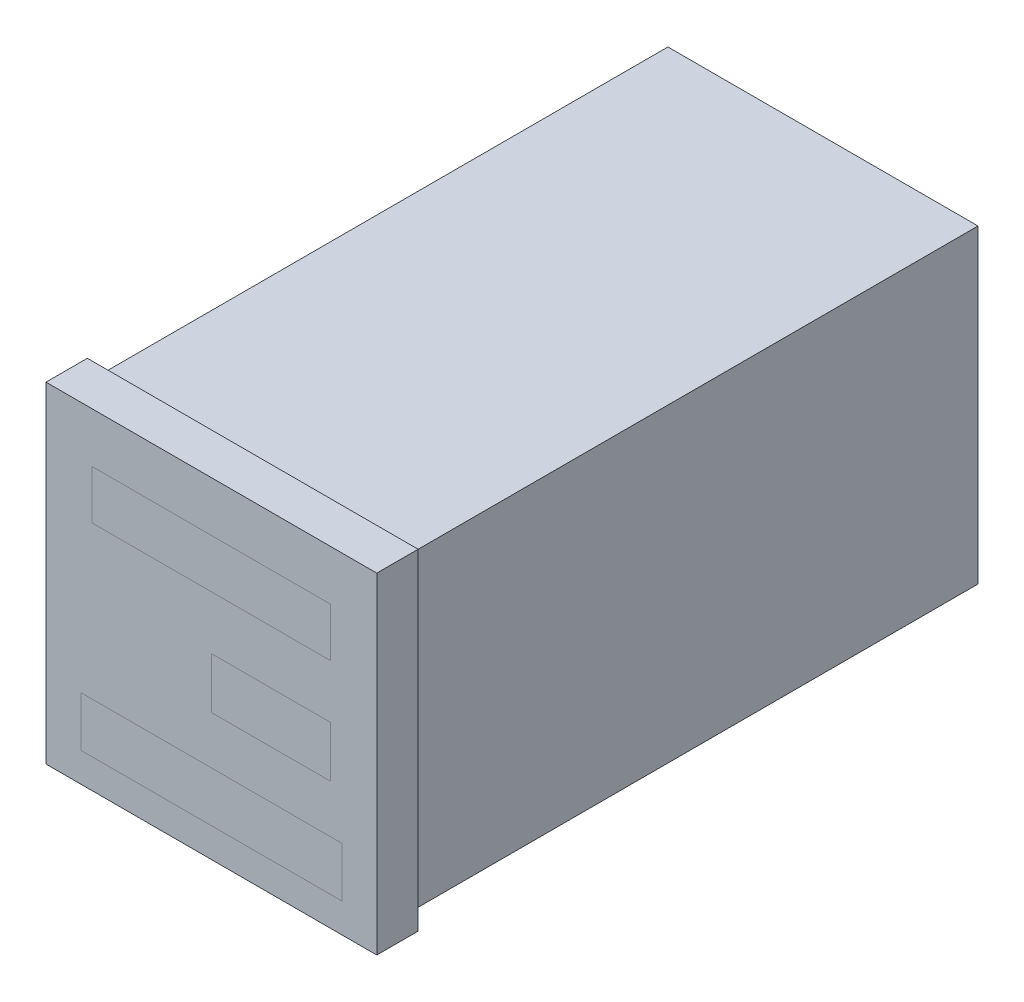
ISO-10303-21;
HEADER;
FILE_DESCRIPTION(('STEP AP214'),'2;1');
FILE_NAME('part.step','',(''),(''),'','','');
FILE_SCHEMA(('AUTOMOTIVE_DESIGN { 1 0 10303 214 1 1 1 1 }'));
ENDSEC;
DATA;
#1=APPLICATION_CONTEXT('core data for automotive mechanical design processes');
#2=APPLICATION_PROTOCOL_DEFINITION('international standard','automotive_design',2000,#1);
#3=PRODUCT_CONTEXT('',#1,'mechanical');
#4=PRODUCT('Part','Part','',(#3));
#5=PRODUCT_RELATED_PRODUCT_CATEGORY('part','',(#4));
#6=PRODUCT_DEFINITION_FORMATION('','',#4);
#7=PRODUCT_DEFINITION_CONTEXT('part definition',#1,'design');
#8=PRODUCT_DEFINITION('design','',#6,#7);
#9=PRODUCT_DEFINITION_SHAPE('','',#8);
#10=(LENGTH_UNIT() NAMED_UNIT(*) SI_UNIT(.MILLI.,.METRE.));
#11=(NAMED_UNIT(*) PLANE_ANGLE_UNIT() SI_UNIT($,.RADIAN.));
#12=(NAMED_UNIT(*) SI_UNIT($,.STERADIAN.) SOLID_ANGLE_UNIT());
#13=UNCERTAINTY_MEASURE_WITH_UNIT(LENGTH_MEASURE(1.E-05),#10,'distance_accuracy_value','');
#14=(GEOMETRIC_REPRESENTATION_CONTEXT(3) GLOBAL_UNCERTAINTY_ASSIGNED_CONTEXT((#13)) GLOBAL_UNIT_ASSIGNED_CONTEXT((#10,
#11,#12)) REPRESENTATION_CONTEXT('',''));
#15=CARTESIAN_POINT('',(0.,0.,0.));
#16=DIRECTION('',(0.,0.,1.));
#17=DIRECTION('',(1.,0.,0.));
#18=AXIS2_PLACEMENT_3D('',#15,#16,#17);
#19=CARTESIAN_POINT('',(0.,0.,0.));
#20=DIRECTION('',(0.,0.,-1.));
#21=DIRECTION('',(-1.,0.,0.));
#22=AXIS2_PLACEMENT_3D('',#19,#20,#21);
#23=PLANE('',#22);
#24=DIRECTION('',(0.,1.,0.));
#25=VECTOR('',#24,1.);
#26=CARTESIAN_POINT('',(17.3085904335153,0.,0.));
#27=LINE('',#26,#25);
#28=CARTESIAN_POINT('',(17.3085904335153,-5.51434302340681,0.));
#29=VERTEX_POINT('',#28);
#30=CARTESIAN_POINT('',(17.3085904335153,1.88343696447646,0.));
#31=VERTEX_POINT('',#30);
#32=EDGE_CURVE('E218',#29,#31,#27,.T.);
#33=ORIENTED_EDGE('',*,*,#32,.F.);
#34=DIRECTION('',(1.,0.,0.));
#35=VECTOR('',#34,1.);
#36=CARTESIAN_POINT('',(0.,-5.51434302340681,0.));
#37=LINE('',#36,#35);
#38=CARTESIAN_POINT('',(0.0240699594087346,-5.51434302340681,0.));
#39=VERTEX_POINT('',#38);
#40=EDGE_CURVE('E208',#39,#29,#37,.T.);
#41=ORIENTED_EDGE('',*,*,#40,.F.);
#42=DIRECTION('',(0.,-1.,0.));
#43=VECTOR('',#42,1.);
#44=CARTESIAN_POINT('',(0.0240699594087346,0.,0.));
#45=LINE('',#44,#43);
#46=CARTESIAN_POINT('',(0.0240699594087346,1.88343696447646,0.));
#47=VERTEX_POINT('',#46);
#48=EDGE_CURVE('E212',#47,#39,#45,.T.);
#49=ORIENTED_EDGE('',*,*,#48,.F.);
#50=DIRECTION('',(-1.,0.,0.));
#51=VECTOR('',#50,1.);
#52=CARTESIAN_POINT('',(0.,1.88343696447646,0.));
#53=LINE('',#52,#51);
#54=EDGE_CURVE('E215',#31,#47,#53,.T.);
#55=ORIENTED_EDGE('',*,*,#54,.F.);
#56=EDGE_LOOP('',(#33,#41,#49,#55));
#57=FACE_BOUND('',#56,.T.);
#58=DIRECTION('',(0.,1.,0.));
#59=VECTOR('',#58,1.);
#60=CARTESIAN_POINT('',(24.,-24.,0.));
#61=LINE('',#60,#59);
#62=CARTESIAN_POINT('',(24.,-24.,0.));
#63=VERTEX_POINT('',#62);
#64=CARTESIAN_POINT('',(24.,24.,0.));
#65=VERTEX_POINT('',#64);
#66=EDGE_CURVE('E158',#63,#65,#61,.T.);
#67=ORIENTED_EDGE('',*,*,#66,.T.);
#68=DIRECTION('',(-1.,0.,0.));
#69=VECTOR('',#68,1.);
#70=CARTESIAN_POINT('',(-24.,24.,0.));
#71=LINE('',#70,#69);
#72=CARTESIAN_POINT('',(-24.,24.,0.));
#73=VERTEX_POINT('',#72);
#74=EDGE_CURVE('E161',#65,#73,#71,.T.);
#75=ORIENTED_EDGE('',*,*,#74,.T.);
#76=DIRECTION('',(0.,-1.,0.));
#77=VECTOR('',#76,1.);
#78=CARTESIAN_POINT('',(-24.,-24.,0.));
#79=LINE('',#78,#77);
#80=CARTESIAN_POINT('',(-24.,-24.,0.));
#81=VERTEX_POINT('',#80);
#82=EDGE_CURVE('E183',#73,#81,#79,.T.);
#83=ORIENTED_EDGE('',*,*,#82,.T.);
#84=DIRECTION('',(1.,0.,0.));
#85=VECTOR('',#84,1.);
#86=CARTESIAN_POINT('',(-24.,-24.,0.));
#87=LINE('',#86,#85);
#88=EDGE_CURVE('E171',#81,#63,#87,.T.);
#89=ORIENTED_EDGE('',*,*,#88,.T.);
#90=EDGE_LOOP('',(#67,#75,#83,#89));
#91=FACE_BOUND('',#90,.T.);
#92=DIRECTION('',(0.,1.,0.));
#93=VECTOR('',#92,1.);
#94=CARTESIAN_POINT('',(17.3085904335153,0.,0.));
#95=LINE('',#94,#93);
#96=CARTESIAN_POINT('',(17.3085904335153,9.64969308896002,0.));
#97=VERTEX_POINT('',#96);
#98=CARTESIAN_POINT('',(17.3085904335153,16.7368745324552,0.));
#99=VERTEX_POINT('',#98);
#100=EDGE_CURVE('E205',#97,#99,#95,.T.);
#101=ORIENTED_EDGE('',*,*,#100,.F.);
#102=DIRECTION('',(1.,0.,0.));
#103=VECTOR('',#102,1.);
#104=CARTESIAN_POINT('',(0.,9.64969308896002,0.));
#105=LINE('',#104,#103);
#106=CARTESIAN_POINT('',(-17.3085904335153,9.64969308896002,0.));
#107=VERTEX_POINT('',#106);
#108=EDGE_CURVE('E190',#107,#97,#105,.T.);
#109=ORIENTED_EDGE('',*,*,#108,.F.);
#110=DIRECTION('',(0.,-1.,0.));
#111=VECTOR('',#110,1.);
#112=CARTESIAN_POINT('',(-17.3085904335153,0.,0.));
#113=LINE('',#112,#111);
#114=CARTESIAN_POINT('',(-17.3085904335153,16.7368745324552,0.));
#115=VERTEX_POINT('',#114);
#116=EDGE_CURVE('E199',#115,#107,#113,.T.);
#117=ORIENTED_EDGE('',*,*,#116,.F.);
#118=DIRECTION('',(-1.,0.,0.));
#119=VECTOR('',#118,1.);
#120=CARTESIAN_POINT('',(0.,16.7368745324552,0.));
#121=LINE('',#120,#119);
#122=EDGE_CURVE('E202',#99,#115,#121,.T.);
#123=ORIENTED_EDGE('',*,*,#122,.F.);
#124=EDGE_LOOP('',(#101,#109,#117,#123));
#125=FACE_BOUND('',#124,.T.);
#126=DIRECTION('',(0.,1.,0.));
#127=VECTOR('',#126,1.);
#128=CARTESIAN_POINT('',(18.9802998389155,0.,0.));
#129=LINE('',#128,#127);
#130=CARTESIAN_POINT('',(18.9802998389155,-19.739129697669,0.));
#131=VERTEX_POINT('',#130);
#132=CARTESIAN_POINT('',(18.9802998389155,-12.4834676194183,0.));
#133=VERTEX_POINT('',#132);
#134=EDGE_CURVE('E11',#131,#133,#129,.T.);
#135=ORIENTED_EDGE('',*,*,#134,.F.);
#136=DIRECTION('',(1.,0.,0.));
#137=VECTOR('',#136,1.);
#138=CARTESIAN_POINT('',(0.,-19.739129697669,0.));
#139=LINE('',#138,#137);
#140=CARTESIAN_POINT('',(-18.932159920098,-19.739129697669,0.));
#141=VERTEX_POINT('',#140);
#142=EDGE_CURVE('E221',#141,#131,#139,.T.);
#143=ORIENTED_EDGE('',*,*,#142,.F.);
#144=DIRECTION('',(0.,-1.,0.));
#145=VECTOR('',#144,1.);
#146=CARTESIAN_POINT('',(-18.932159920098,0.,0.));
#147=LINE('',#146,#145);
#148=CARTESIAN_POINT('',(-18.932159920098,-12.4834676194183,0.));
#149=VERTEX_POINT('',#148);
#150=EDGE_CURVE('E224',#149,#141,#147,.T.);
#151=ORIENTED_EDGE('',*,*,#150,.F.);
#152=DIRECTION('',(-1.,0.,0.));
#153=VECTOR('',#152,1.);
#154=CARTESIAN_POINT('',(0.,-12.4834676194183,0.));
#155=LINE('',#154,#153);
#156=EDGE_CURVE('E45',#133,#149,#155,.T.);
#157=ORIENTED_EDGE('',*,*,#156,.F.);
#158=EDGE_LOOP('',(#135,#143,#151,#157));
#159=FACE_BOUND('',#158,.T.);
#160=ADVANCED_FACE('F36',(#57,#91,#125,#159),#23,.F.);
#161=ORIENTED_EDGE('',*,*,#142,.T.);
#162=ORIENTED_EDGE('',*,*,#134,.T.);
#163=ORIENTED_EDGE('',*,*,#156,.T.);
#164=ORIENTED_EDGE('',*,*,#150,.T.);
#165=EDGE_LOOP('',(#161,#162,#163,#164));
#166=FACE_BOUND('',#165,.T.);
#167=ADVANCED_FACE('F252',(#166),#23,.F.);
#168=ORIENTED_EDGE('',*,*,#40,.T.);
#169=ORIENTED_EDGE('',*,*,#32,.T.);
#170=ORIENTED_EDGE('',*,*,#54,.T.);
#171=ORIENTED_EDGE('',*,*,#48,.T.);
#172=EDGE_LOOP('',(#168,#169,#170,#171));
#173=FACE_BOUND('',#172,.T.);
#174=ADVANCED_FACE('F261',(#173),#23,.F.);
#175=CARTESIAN_POINT('',(24.,-24.,-6.));
#176=DIRECTION('',(1.,0.,0.));
#177=DIRECTION('',(0.,0.,-1.));
#178=AXIS2_PLACEMENT_3D('',#175,#176,#177);
#179=PLANE('',#178);
#180=ORIENTED_EDGE('',*,*,#66,.F.);
#181=DIRECTION('',(0.,0.,1.));
#182=VECTOR('',#181,1.);
#183=CARTESIAN_POINT('',(24.,-24.,-6.));
#184=LINE('',#183,#182);
#185=CARTESIAN_POINT('',(24.,-24.,-6.));
#186=VERTEX_POINT('',#185);
#187=EDGE_CURVE('E188',#186,#63,#184,.T.);
#188=ORIENTED_EDGE('',*,*,#187,.F.);
#189=DIRECTION('',(0.,1.,0.));
#190=VECTOR('',#189,1.);
#191=CARTESIAN_POINT('',(24.,-24.,-6.));
#192=LINE('',#191,#190);
#193=CARTESIAN_POINT('',(24.,24.,-6.));
#194=VERTEX_POINT('',#193);
#195=EDGE_CURVE('E167',#186,#194,#192,.T.);
#196=ORIENTED_EDGE('',*,*,#195,.T.);
#197=DIRECTION('',(0.,0.,1.));
#198=VECTOR('',#197,1.);
#199=CARTESIAN_POINT('',(24.,24.,-6.));
#200=LINE('',#199,#198);
#201=EDGE_CURVE('E179',#194,#65,#200,.T.);
#202=ORIENTED_EDGE('',*,*,#201,.T.);
#203=EDGE_LOOP('',(#180,#188,#196,#202));
#204=FACE_BOUND('',#203,.T.);
#205=ADVANCED_FACE('F38',(#204),#179,.T.);
#206=CARTESIAN_POINT('',(-24.,-24.,-6.));
#207=DIRECTION('',(0.,-1.,0.));
#208=DIRECTION('',(0.,0.,-1.));
#209=AXIS2_PLACEMENT_3D('',#206,#207,#208);
#210=PLANE('',#209);
#211=ORIENTED_EDGE('',*,*,#88,.F.);
#212=DIRECTION('',(0.,0.,1.));
#213=VECTOR('',#212,1.);
#214=CARTESIAN_POINT('',(-24.,-24.,-6.));
#215=LINE('',#214,#213);
#216=CARTESIAN_POINT('',(-24.,-24.,-6.));
#217=VERTEX_POINT('',#216);
#218=EDGE_CURVE('E191',#217,#81,#215,.T.);
#219=ORIENTED_EDGE('',*,*,#218,.F.);
#220=DIRECTION('',(1.,0.,0.));
#221=VECTOR('',#220,1.);
#222=CARTESIAN_POINT('',(-24.,-24.,-6.));
#223=LINE('',#222,#221);
#224=EDGE_CURVE('E177',#217,#186,#223,.T.);
#225=ORIENTED_EDGE('',*,*,#224,.T.);
#226=ORIENTED_EDGE('',*,*,#187,.T.);
#227=EDGE_LOOP('',(#211,#219,#225,#226));
#228=FACE_BOUND('',#227,.T.);
#229=ADVANCED_FACE('F280',(#228),#210,.T.);
#230=CARTESIAN_POINT('',(-24.,-24.,-6.));
#231=DIRECTION('',(-1.,0.,0.));
#232=DIRECTION('',(0.,0.,1.));
#233=AXIS2_PLACEMENT_3D('',#230,#231,#232);
#234=PLANE('',#233);
#235=ORIENTED_EDGE('',*,*,#82,.F.);
#236=DIRECTION('',(0.,0.,1.));
#237=VECTOR('',#236,1.);
#238=CARTESIAN_POINT('',(-24.,24.,-6.));
#239=LINE('',#238,#237);
#240=CARTESIAN_POINT('',(-24.,24.,-6.));
#241=VERTEX_POINT('',#240);
#242=EDGE_CURVE('E193',#241,#73,#239,.T.);
#243=ORIENTED_EDGE('',*,*,#242,.F.);
#244=DIRECTION('',(0.,-1.,0.));
#245=VECTOR('',#244,1.);
#246=CARTESIAN_POINT('',(-24.,-24.,-6.));
#247=LINE('',#246,#245);
#248=EDGE_CURVE('E174',#241,#217,#247,.T.);
#249=ORIENTED_EDGE('',*,*,#248,.T.);
#250=ORIENTED_EDGE('',*,*,#218,.T.);
#251=EDGE_LOOP('',(#235,#243,#249,#250));
#252=FACE_BOUND('',#251,.T.);
#253=ADVANCED_FACE('F288',(#252),#234,.T.);
#254=CARTESIAN_POINT('',(-24.,24.,-6.));
#255=DIRECTION('',(0.,1.,0.));
#256=DIRECTION('',(0.,0.,1.));
#257=AXIS2_PLACEMENT_3D('',#254,#255,#256);
#258=PLANE('',#257);
#259=ORIENTED_EDGE('',*,*,#74,.F.);
#260=ORIENTED_EDGE('',*,*,#201,.F.);
#261=DIRECTION('',(-1.,0.,0.));
#262=VECTOR('',#261,1.);
#263=CARTESIAN_POINT('',(-24.,24.,-6.));
#264=LINE('',#263,#262);
#265=EDGE_CURVE('E170',#194,#241,#264,.T.);
#266=ORIENTED_EDGE('',*,*,#265,.T.);
#267=ORIENTED_EDGE('',*,*,#242,.T.);
#268=EDGE_LOOP('',(#259,#260,#266,#267));
#269=FACE_BOUND('',#268,.T.);
#270=ADVANCED_FACE('F273',(#269),#258,.T.);
#271=CARTESIAN_POINT('',(0.,0.,-6.));
#272=DIRECTION('',(0.,0.,-1.));
#273=DIRECTION('',(-1.,0.,0.));
#274=AXIS2_PLACEMENT_3D('',#271,#272,#273);
#275=PLANE('',#274);
#276=DIRECTION('',(0.,1.,0.));
#277=VECTOR('',#276,1.);
#278=CARTESIAN_POINT('',(-22.5,-22.5,-6.));
#279=LINE('',#278,#277);
#280=CARTESIAN_POINT('',(-22.5,-22.5,-6.));
#281=VERTEX_POINT('',#280);
#282=CARTESIAN_POINT('',(-22.5,22.5,-6.));
#283=VERTEX_POINT('',#282);
#284=EDGE_CURVE('E157',#281,#283,#279,.T.);
#285=ORIENTED_EDGE('',*,*,#284,.F.);
#286=DIRECTION('',(-1.,0.,0.));
#287=VECTOR('',#286,1.);
#288=CARTESIAN_POINT('',(22.5,-22.5,-6.));
#289=LINE('',#288,#287);
#290=CARTESIAN_POINT('',(22.5,-22.5,-6.));
#291=VERTEX_POINT('',#290);
#292=EDGE_CURVE('E154',#291,#281,#289,.T.);
#293=ORIENTED_EDGE('',*,*,#292,.F.);
#294=DIRECTION('',(0.,-1.,0.));
#295=VECTOR('',#294,1.);
#296=CARTESIAN_POINT('',(22.5,-22.5,-6.));
#297=LINE('',#296,#295);
#298=CARTESIAN_POINT('',(22.5,22.5,-6.));
#299=VERTEX_POINT('',#298);
#300=EDGE_CURVE('E417',#299,#291,#297,.T.);
#301=ORIENTED_EDGE('',*,*,#300,.F.);
#302=DIRECTION('',(1.,0.,0.));
#303=VECTOR('',#302,1.);
#304=CARTESIAN_POINT('',(22.5,22.5,-6.));
#305=LINE('',#304,#303);
#306=EDGE_CURVE('E423',#283,#299,#305,.T.);
#307=ORIENTED_EDGE('',*,*,#306,.F.);
#308=EDGE_LOOP('',(#285,#293,#301,#307));
#309=FACE_BOUND('',#308,.T.);
#310=ORIENTED_EDGE('',*,*,#195,.F.);
#311=ORIENTED_EDGE('',*,*,#224,.F.);
#312=ORIENTED_EDGE('',*,*,#248,.F.);
#313=ORIENTED_EDGE('',*,*,#265,.F.);
#314=EDGE_LOOP('',(#310,#311,#312,#313));
#315=FACE_BOUND('',#314,.T.);
#316=ADVANCED_FACE('F266',(#309,#315),#275,.T.);
#317=ORIENTED_EDGE('',*,*,#108,.T.);
#318=ORIENTED_EDGE('',*,*,#100,.T.);
#319=ORIENTED_EDGE('',*,*,#122,.T.);
#320=ORIENTED_EDGE('',*,*,#116,.T.);
#321=EDGE_LOOP('',(#317,#318,#319,#320));
#322=FACE_BOUND('',#321,.T.);
#323=ADVANCED_FACE('F257',(#322),#23,.F.);
#324=CARTESIAN_POINT('',(-22.5,-22.5,-88.75));
#325=DIRECTION('',(1.,0.,0.));
#326=DIRECTION('',(0.,0.,-1.));
#327=AXIS2_PLACEMENT_3D('',#324,#325,#326);
#328=PLANE('',#327);
#329=ORIENTED_EDGE('',*,*,#284,.T.);
#330=DIRECTION('',(0.,0.,1.));
#331=VECTOR('',#330,1.);
#332=CARTESIAN_POINT('',(-22.5,22.5,-88.75));
#333=LINE('',#332,#331);
#334=CARTESIAN_POINT('',(-22.5,22.5,-88.75));
#335=VERTEX_POINT('',#334);
#336=EDGE_CURVE('E138',#335,#283,#333,.T.);
#337=ORIENTED_EDGE('',*,*,#336,.F.);
#338=DIRECTION('',(0.,1.,0.));
#339=VECTOR('',#338,1.);
#340=CARTESIAN_POINT('',(-22.5,-22.5,-88.75));
#341=LINE('',#340,#339);
#342=CARTESIAN_POINT('',(-22.5,-22.5,-88.75));
#343=VERTEX_POINT('',#342);
#344=EDGE_CURVE('E145',#343,#335,#341,.T.);
#345=ORIENTED_EDGE('',*,*,#344,.F.);
#346=DIRECTION('',(0.,0.,1.));
#347=VECTOR('',#346,1.);
#348=CARTESIAN_POINT('',(-22.5,-22.5,-88.75));
#349=LINE('',#348,#347);
#350=EDGE_CURVE('E414',#343,#281,#349,.T.);
#351=ORIENTED_EDGE('',*,*,#350,.T.);
#352=EDGE_LOOP('',(#329,#337,#345,#351));
#353=FACE_BOUND('',#352,.T.);
#354=ADVANCED_FACE('F156',(#353),#328,.F.);
#355=CARTESIAN_POINT('',(22.5,22.5,-88.75));
#356=DIRECTION('',(0.,-1.,0.));
#357=DIRECTION('',(0.,0.,-1.));
#358=AXIS2_PLACEMENT_3D('',#355,#356,#357);
#359=PLANE('',#358);
#360=ORIENTED_EDGE('',*,*,#306,.T.);
#361=DIRECTION('',(0.,0.,1.));
#362=VECTOR('',#361,1.);
#363=CARTESIAN_POINT('',(22.5,22.5,-88.75));
#364=LINE('',#363,#362);
#365=CARTESIAN_POINT('',(22.5,22.5,-88.75));
#366=VERTEX_POINT('',#365);
#367=EDGE_CURVE('E141',#366,#299,#364,.T.);
#368=ORIENTED_EDGE('',*,*,#367,.F.);
#369=DIRECTION('',(1.,0.,0.));
#370=VECTOR('',#369,1.);
#371=CARTESIAN_POINT('',(22.5,22.5,-88.75));
#372=LINE('',#371,#370);
#373=EDGE_CURVE('E133',#335,#366,#372,.T.);
#374=ORIENTED_EDGE('',*,*,#373,.F.);
#375=ORIENTED_EDGE('',*,*,#336,.T.);
#376=EDGE_LOOP('',(#360,#368,#374,#375));
#377=FACE_BOUND('',#376,.T.);
#378=ADVANCED_FACE('F136',(#377),#359,.F.);
#379=CARTESIAN_POINT('',(22.5,-22.5,-88.75));
#380=DIRECTION('',(-1.,0.,0.));
#381=DIRECTION('',(0.,0.,1.));
#382=AXIS2_PLACEMENT_3D('',#379,#380,#381);
#383=PLANE('',#382);
#384=ORIENTED_EDGE('',*,*,#300,.T.);
#385=DIRECTION('',(0.,0.,1.));
#386=VECTOR('',#385,1.);
#387=CARTESIAN_POINT('',(22.5,-22.5,-88.75));
#388=LINE('',#387,#386);
#389=CARTESIAN_POINT('',(22.5,-22.5,-88.75));
#390=VERTEX_POINT('',#389);
#391=EDGE_CURVE('E163',#390,#291,#388,.T.);
#392=ORIENTED_EDGE('',*,*,#391,.F.);
#393=DIRECTION('',(0.,-1.,0.));
#394=VECTOR('',#393,1.);
#395=CARTESIAN_POINT('',(22.5,-22.5,-88.75));
#396=LINE('',#395,#394);
#397=EDGE_CURVE('E144',#366,#390,#396,.T.);
#398=ORIENTED_EDGE('',*,*,#397,.F.);
#399=ORIENTED_EDGE('',*,*,#367,.T.);
#400=EDGE_LOOP('',(#384,#392,#398,#399));
#401=FACE_BOUND('',#400,.T.);
#402=ADVANCED_FACE('F331',(#401),#383,.F.);
#403=CARTESIAN_POINT('',(22.5,-22.5,-88.75));
#404=DIRECTION('',(0.,1.,0.));
#405=DIRECTION('',(0.,0.,1.));
#406=AXIS2_PLACEMENT_3D('',#403,#404,#405);
#407=PLANE('',#406);
#408=ORIENTED_EDGE('',*,*,#292,.T.);
#409=ORIENTED_EDGE('',*,*,#350,.F.);
#410=DIRECTION('',(-1.,0.,0.));
#411=VECTOR('',#410,1.);
#412=CARTESIAN_POINT('',(22.5,-22.5,-88.75));
#413=LINE('',#412,#411);
#414=EDGE_CURVE('E150',#390,#343,#413,.T.);
#415=ORIENTED_EDGE('',*,*,#414,.F.);
#416=ORIENTED_EDGE('',*,*,#391,.T.);
#417=EDGE_LOOP('',(#408,#409,#415,#416));
#418=FACE_BOUND('',#417,.T.);
#419=ADVANCED_FACE('F340',(#418),#407,.F.);
#420=CARTESIAN_POINT('',(0.,0.,-88.75));
#421=DIRECTION('',(0.,0.,1.));
#422=DIRECTION('',(1.,0.,0.));
#423=AXIS2_PLACEMENT_3D('',#420,#421,#422);
#424=PLANE('',#423);
#425=ORIENTED_EDGE('',*,*,#344,.T.);
#426=ORIENTED_EDGE('',*,*,#373,.T.);
#427=ORIENTED_EDGE('',*,*,#397,.T.);
#428=ORIENTED_EDGE('',*,*,#414,.T.);
#429=EDGE_LOOP('',(#425,#426,#427,#428));
#430=FACE_BOUND('',#429,.T.);
#431=ADVANCED_FACE('F148',(#430),#424,.F.);
#432=CLOSED_SHELL('',(#160,#167,#174,#205,#229,#253,#270,#316,#323,#354,#378,#402,#419,#431));
#433=MANIFOLD_SOLID_BREP('B2',#432);
#434=ADVANCED_BREP_SHAPE_REPRESENTATION('',(#18,#433),#14);
#435=SHAPE_DEFINITION_REPRESENTATION(#9,#434);
ENDSEC;
END-ISO-10303-21;
